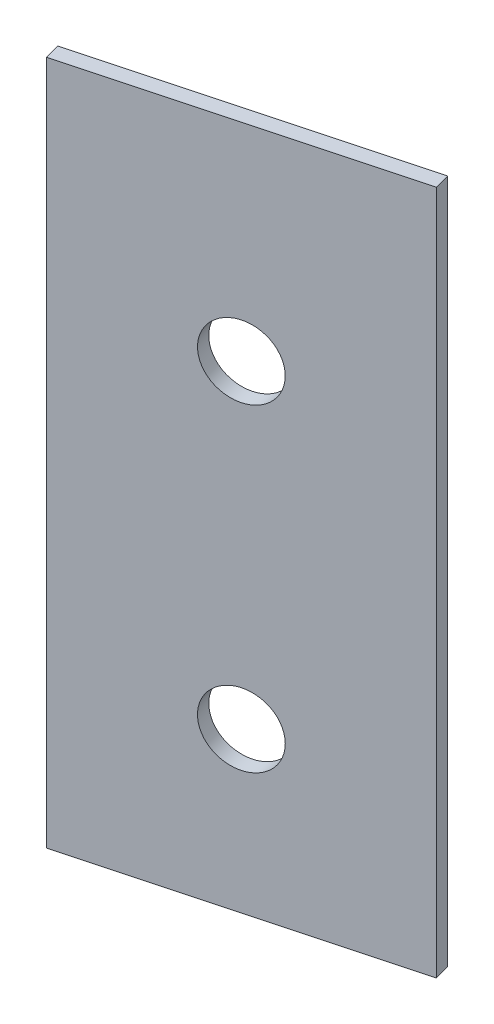
ISO-10303-21;
HEADER;
FILE_DESCRIPTION(('STEP AP214'),'2;1');
FILE_NAME('part.step','',(''),(''),'','','');
FILE_SCHEMA(('AUTOMOTIVE_DESIGN { 1 0 10303 214 1 1 1 1 }'));
ENDSEC;
DATA;
#1=APPLICATION_CONTEXT('core data for automotive mechanical design processes');
#2=APPLICATION_PROTOCOL_DEFINITION('international standard','automotive_design',2000,#1);
#3=PRODUCT_CONTEXT('',#1,'mechanical');
#4=PRODUCT('Part','Part','',(#3));
#5=PRODUCT_RELATED_PRODUCT_CATEGORY('part','',(#4));
#6=PRODUCT_DEFINITION_FORMATION('','',#4);
#7=PRODUCT_DEFINITION_CONTEXT('part definition',#1,'design');
#8=PRODUCT_DEFINITION('design','',#6,#7);
#9=PRODUCT_DEFINITION_SHAPE('','',#8);
#10=(LENGTH_UNIT() NAMED_UNIT(*) SI_UNIT(.MILLI.,.METRE.));
#11=(NAMED_UNIT(*) PLANE_ANGLE_UNIT() SI_UNIT($,.RADIAN.));
#12=(NAMED_UNIT(*) SI_UNIT($,.STERADIAN.) SOLID_ANGLE_UNIT());
#13=UNCERTAINTY_MEASURE_WITH_UNIT(LENGTH_MEASURE(1.E-05),#10,'distance_accuracy_value','');
#14=(GEOMETRIC_REPRESENTATION_CONTEXT(3) GLOBAL_UNCERTAINTY_ASSIGNED_CONTEXT((#13)) GLOBAL_UNIT_ASSIGNED_CONTEXT((#10,
#11,#12)) REPRESENTATION_CONTEXT('',''));
#15=CARTESIAN_POINT('',(0.,0.,0.));
#16=DIRECTION('',(0.,0.,1.));
#17=DIRECTION('',(1.,0.,0.));
#18=AXIS2_PLACEMENT_3D('',#15,#16,#17);
#19=CARTESIAN_POINT('',(1812.776389578,1639.,2452.485160249));
#20=DIRECTION('',(-0.258819045102985,0.,-0.965925826288944));
#21=DIRECTION('',(0.965925826288944,0.,-0.258819045102985));
#22=AXIS2_PLACEMENT_3D('',#19,#20,#21);
#23=CYLINDRICAL_SURFACE('',#22,4.5);
#24=CARTESIAN_POINT('',(1812.778977768,1639.,2452.494819508));
#25=DIRECTION('',(-0.258819045102985,0.,-0.965925826288944));
#26=DIRECTION('',(0.965925826288944,0.,-0.258819045102985));
#27=AXIS2_PLACEMENT_3D('',#24,#25,#26);
#28=CIRCLE('',#27,4.5);
#29=CARTESIAN_POINT('',(1817.125643986,1639.,2451.330133805));
#30=VERTEX_POINT('',#29);
#31=EDGE_CURVE('E60',#30,#30,#28,.T.);
#32=ORIENTED_EDGE('',*,*,#31,.T.);
#33=DIRECTION('',(0.258819045102985,0.,0.965925826288944));
#34=VECTOR('',#33,1.);
#35=CARTESIAN_POINT('',(1817.123055796,1639.,2451.320474546));
#36=LINE('',#35,#34);
#37=CARTESIAN_POINT('',(1817.643282077,1639.,2453.261985457));
#38=VERTEX_POINT('',#37);
#39=EDGE_CURVE('E11',#30,#38,#36,.T.);
#40=ORIENTED_EDGE('',*,*,#39,.T.);
#41=CARTESIAN_POINT('',(1813.296615858,1639.,2454.42667116));
#42=DIRECTION('',(-0.258819045102985,0.,-0.965925826288944));
#43=DIRECTION('',(0.965925826288944,0.,-0.258819045102985));
#44=AXIS2_PLACEMENT_3D('',#41,#42,#43);
#45=CIRCLE('',#44,4.5);
#46=EDGE_CURVE('E58',#38,#38,#45,.T.);
#47=ORIENTED_EDGE('',*,*,#46,.F.);
#48=ORIENTED_EDGE('',*,*,#39,.F.);
#49=EDGE_LOOP('',(#32,#40,#47,#48));
#50=FACE_BOUND('',#49,.T.);
#51=ADVANCED_FACE('F17',(#50),#23,.F.);
#52=CARTESIAN_POINT('',(1812.776389578,1599.,2452.485160249));
#53=DIRECTION('',(-0.258819045102985,0.,-0.965925826288944));
#54=DIRECTION('',(0.965925826288944,0.,-0.258819045102985));
#55=AXIS2_PLACEMENT_3D('',#52,#53,#54);
#56=CYLINDRICAL_SURFACE('',#55,4.5);
#57=CARTESIAN_POINT('',(1812.778977768,1599.,2452.494819508));
#58=DIRECTION('',(-0.258819045102985,0.,-0.965925826288944));
#59=DIRECTION('',(0.965925826288944,0.,-0.258819045102985));
#60=AXIS2_PLACEMENT_3D('',#57,#58,#59);
#61=CIRCLE('',#60,4.5);
#62=CARTESIAN_POINT('',(1817.125643986,1599.,2451.330133805));
#63=VERTEX_POINT('',#62);
#64=EDGE_CURVE('E95',#63,#63,#61,.T.);
#65=ORIENTED_EDGE('',*,*,#64,.T.);
#66=DIRECTION('',(0.258819045102985,0.,0.965925826288944));
#67=VECTOR('',#66,1.);
#68=CARTESIAN_POINT('',(1817.123055796,1599.,2451.320474546));
#69=LINE('',#68,#67);
#70=CARTESIAN_POINT('',(1817.643282077,1599.,2453.261985457));
#71=VERTEX_POINT('',#70);
#72=EDGE_CURVE('E25',#63,#71,#69,.T.);
#73=ORIENTED_EDGE('',*,*,#72,.T.);
#74=CARTESIAN_POINT('',(1813.296615858,1599.,2454.42667116));
#75=DIRECTION('',(-0.258819045102985,0.,-0.965925826288944));
#76=DIRECTION('',(0.965925826288944,0.,-0.258819045102985));
#77=AXIS2_PLACEMENT_3D('',#74,#75,#76);
#78=CIRCLE('',#77,4.5);
#79=EDGE_CURVE('E66',#71,#71,#78,.T.);
#80=ORIENTED_EDGE('',*,*,#79,.F.);
#81=ORIENTED_EDGE('',*,*,#72,.F.);
#82=EDGE_LOOP('',(#65,#73,#80,#81));
#83=FACE_BOUND('',#82,.T.);
#84=ADVANCED_FACE('F177',(#83),#56,.F.);
#85=CARTESIAN_POINT('',(1832.097494294,1579.,2447.318438606));
#86=DIRECTION('',(0.965925826288944,0.,-0.258819045102985));
#87=DIRECTION('',(0.,-1.,0.));
#88=AXIS2_PLACEMENT_3D('',#85,#86,#87);
#89=PLANE('',#88);
#90=DIRECTION('',(0.258819045102985,0.,0.965925826288944));
#91=VECTOR('',#90,1.);
#92=CARTESIAN_POINT('',(1832.097494294,1579.,2447.318438606));
#93=LINE('',#92,#91);
#94=CARTESIAN_POINT('',(1832.097494294,1579.,2447.318438606));
#95=VERTEX_POINT('',#94);
#96=CARTESIAN_POINT('',(1832.615132384,1579.,2449.250290258));
#97=VERTEX_POINT('',#96);
#98=EDGE_CURVE('E104',#95,#97,#93,.T.);
#99=ORIENTED_EDGE('',*,*,#98,.F.);
#100=DIRECTION('',(0.,1.,0.));
#101=VECTOR('',#100,1.);
#102=CARTESIAN_POINT('',(1832.097494294,1579.,2447.318438606));
#103=LINE('',#102,#101);
#104=CARTESIAN_POINT('',(1832.097494294,1665.,2447.318438606));
#105=VERTEX_POINT('',#104);
#106=EDGE_CURVE('E92',#95,#105,#103,.T.);
#107=ORIENTED_EDGE('',*,*,#106,.T.);
#108=DIRECTION('',(0.258819045102985,0.,0.965925826288944));
#109=VECTOR('',#108,1.);
#110=CARTESIAN_POINT('',(1832.097494294,1665.,2447.318438606));
#111=LINE('',#110,#109);
#112=CARTESIAN_POINT('',(1832.615132384,1665.,2449.250290258));
#113=VERTEX_POINT('',#112);
#114=EDGE_CURVE('E73',#105,#113,#111,.T.);
#115=ORIENTED_EDGE('',*,*,#114,.T.);
#116=DIRECTION('',(0.,1.,0.));
#117=VECTOR('',#116,1.);
#118=CARTESIAN_POINT('',(1832.615132384,1579.,2449.250290258));
#119=LINE('',#118,#117);
#120=EDGE_CURVE('E86',#97,#113,#119,.T.);
#121=ORIENTED_EDGE('',*,*,#120,.F.);
#122=EDGE_LOOP('',(#99,#107,#115,#121));
#123=FACE_BOUND('',#122,.T.);
#124=ADVANCED_FACE('F163',(#123),#89,.T.);
#125=CARTESIAN_POINT('',(1793.460461242,1579.,2457.67120041));
#126=DIRECTION('',(0.258819045102985,0.,0.965925826288944));
#127=DIRECTION('',(0.,-1.,0.));
#128=AXIS2_PLACEMENT_3D('',#125,#126,#127);
#129=PLANE('',#128);
#130=ORIENTED_EDGE('',*,*,#31,.F.);
#131=EDGE_LOOP('',(#130));
#132=FACE_BOUND('',#131,.T.);
#133=ORIENTED_EDGE('',*,*,#64,.F.);
#134=EDGE_LOOP('',(#133));
#135=FACE_BOUND('',#134,.T.);
#136=DIRECTION('',(0.965925826288944,0.,-0.258819045102985));
#137=VECTOR('',#136,1.);
#138=CARTESIAN_POINT('',(1793.460461242,1665.,2457.67120041));
#139=LINE('',#138,#137);
#140=CARTESIAN_POINT('',(1793.460461242,1665.,2457.67120041));
#141=VERTEX_POINT('',#140);
#142=EDGE_CURVE('E65',#141,#105,#139,.T.);
#143=ORIENTED_EDGE('',*,*,#142,.T.);
#144=ORIENTED_EDGE('',*,*,#106,.F.);
#145=DIRECTION('',(0.965925826288944,0.,-0.258819045102985));
#146=VECTOR('',#145,1.);
#147=CARTESIAN_POINT('',(1793.460461242,1579.,2457.67120041));
#148=LINE('',#147,#146);
#149=CARTESIAN_POINT('',(1793.460461242,1579.,2457.67120041));
#150=VERTEX_POINT('',#149);
#151=EDGE_CURVE('E83',#150,#95,#148,.T.);
#152=ORIENTED_EDGE('',*,*,#151,.F.);
#153=DIRECTION('',(0.,1.,0.));
#154=VECTOR('',#153,1.);
#155=CARTESIAN_POINT('',(1793.460461242,1579.,2457.67120041));
#156=LINE('',#155,#154);
#157=EDGE_CURVE('E110',#150,#141,#156,.T.);
#158=ORIENTED_EDGE('',*,*,#157,.T.);
#159=EDGE_LOOP('',(#143,#144,#152,#158));
#160=FACE_BOUND('',#159,.T.);
#161=ADVANCED_FACE('F168',(#132,#135,#160),#129,.F.);
#162=CARTESIAN_POINT('',(1793.460461242,1665.,2457.67120041));
#163=DIRECTION('',(0.,1.,0.));
#164=DIRECTION('',(1.,0.,0.));
#165=AXIS2_PLACEMENT_3D('',#162,#163,#164);
#166=PLANE('',#165);
#167=ORIENTED_EDGE('',*,*,#142,.F.);
#168=DIRECTION('',(0.258819045102985,0.,0.965925826288944));
#169=VECTOR('',#168,1.);
#170=CARTESIAN_POINT('',(1793.460461242,1665.,2457.67120041));
#171=LINE('',#170,#169);
#172=CARTESIAN_POINT('',(1793.978099332,1665.,2459.603052062));
#173=VERTEX_POINT('',#172);
#174=EDGE_CURVE('E115',#141,#173,#171,.T.);
#175=ORIENTED_EDGE('',*,*,#174,.T.);
#176=DIRECTION('',(0.965925826288944,0.,-0.258819045102985));
#177=VECTOR('',#176,1.);
#178=CARTESIAN_POINT('',(1793.978099332,1665.,2459.603052062));
#179=LINE('',#178,#177);
#180=EDGE_CURVE('E77',#173,#113,#179,.T.);
#181=ORIENTED_EDGE('',*,*,#180,.T.);
#182=ORIENTED_EDGE('',*,*,#114,.F.);
#183=EDGE_LOOP('',(#167,#175,#181,#182));
#184=FACE_BOUND('',#183,.T.);
#185=ADVANCED_FACE('F165',(#184),#166,.T.);
#186=CARTESIAN_POINT('',(1793.978099332,1579.,2459.603052062));
#187=DIRECTION('',(0.258819045102985,0.,0.965925826288944));
#188=DIRECTION('',(0.,-1.,0.));
#189=AXIS2_PLACEMENT_3D('',#186,#187,#188);
#190=PLANE('',#189);
#191=ORIENTED_EDGE('',*,*,#46,.T.);
#192=EDGE_LOOP('',(#191));
#193=FACE_BOUND('',#192,.T.);
#194=ORIENTED_EDGE('',*,*,#79,.T.);
#195=EDGE_LOOP('',(#194));
#196=FACE_BOUND('',#195,.T.);
#197=DIRECTION('',(0.,1.,0.));
#198=VECTOR('',#197,1.);
#199=CARTESIAN_POINT('',(1793.978099332,1579.,2459.603052062));
#200=LINE('',#199,#198);
#201=CARTESIAN_POINT('',(1793.978099332,1579.,2459.603052062));
#202=VERTEX_POINT('',#201);
#203=EDGE_CURVE('E119',#202,#173,#200,.T.);
#204=ORIENTED_EDGE('',*,*,#203,.F.);
#205=DIRECTION('',(0.965925826288944,0.,-0.258819045102985));
#206=VECTOR('',#205,1.);
#207=CARTESIAN_POINT('',(1793.978099332,1579.,2459.603052062));
#208=LINE('',#207,#206);
#209=EDGE_CURVE('E81',#202,#97,#208,.T.);
#210=ORIENTED_EDGE('',*,*,#209,.T.);
#211=ORIENTED_EDGE('',*,*,#120,.T.);
#212=ORIENTED_EDGE('',*,*,#180,.F.);
#213=EDGE_LOOP('',(#204,#210,#211,#212));
#214=FACE_BOUND('',#213,.T.);
#215=ADVANCED_FACE('F62',(#193,#196,#214),#190,.T.);
#216=CARTESIAN_POINT('',(1793.460461242,1579.,2457.67120041));
#217=DIRECTION('',(0.,1.,0.));
#218=DIRECTION('',(1.,0.,0.));
#219=AXIS2_PLACEMENT_3D('',#216,#217,#218);
#220=PLANE('',#219);
#221=ORIENTED_EDGE('',*,*,#98,.T.);
#222=ORIENTED_EDGE('',*,*,#209,.F.);
#223=DIRECTION('',(0.258819045102985,0.,0.965925826288944));
#224=VECTOR('',#223,1.);
#225=CARTESIAN_POINT('',(1793.460461242,1579.,2457.67120041));
#226=LINE('',#225,#224);
#227=EDGE_CURVE('E107',#150,#202,#226,.T.);
#228=ORIENTED_EDGE('',*,*,#227,.F.);
#229=ORIENTED_EDGE('',*,*,#151,.T.);
#230=EDGE_LOOP('',(#221,#222,#228,#229));
#231=FACE_BOUND('',#230,.T.);
#232=ADVANCED_FACE('F208',(#231),#220,.F.);
#233=CARTESIAN_POINT('',(1793.460461242,1579.,2457.67120041));
#234=DIRECTION('',(0.965925826288944,0.,-0.258819045102985));
#235=DIRECTION('',(0.,-1.,0.));
#236=AXIS2_PLACEMENT_3D('',#233,#234,#235);
#237=PLANE('',#236);
#238=ORIENTED_EDGE('',*,*,#203,.T.);
#239=ORIENTED_EDGE('',*,*,#174,.F.);
#240=ORIENTED_EDGE('',*,*,#157,.F.);
#241=ORIENTED_EDGE('',*,*,#227,.T.);
#242=EDGE_LOOP('',(#238,#239,#240,#241));
#243=FACE_BOUND('',#242,.T.);
#244=ADVANCED_FACE('F130',(#243),#237,.F.);
#245=CLOSED_SHELL('',(#51,#84,#124,#161,#185,#215,#232,#244));
#246=MANIFOLD_SOLID_BREP('B1',#245);
#247=ADVANCED_BREP_SHAPE_REPRESENTATION('',(#18,#246),#14);
#248=SHAPE_DEFINITION_REPRESENTATION(#9,#247);
ENDSEC;
END-ISO-10303-21;
